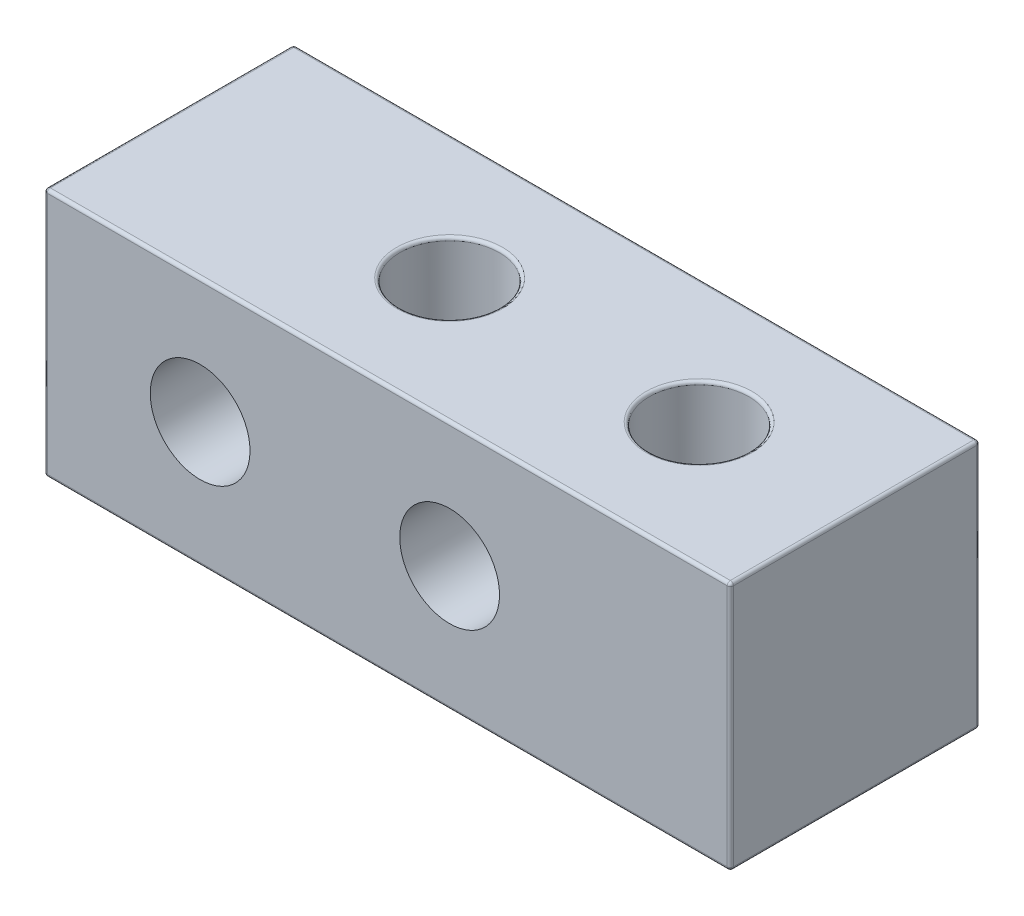
ISO-10303-21;
HEADER;
FILE_DESCRIPTION(('STEP AP214'),'2;1');
FILE_NAME('part.step','',(''),(''),'','','');
FILE_SCHEMA(('AUTOMOTIVE_DESIGN { 1 0 10303 214 1 1 1 1 }'));
ENDSEC;
DATA;
#1=APPLICATION_CONTEXT('core data for automotive mechanical design processes');
#2=APPLICATION_PROTOCOL_DEFINITION('international standard','automotive_design',2000,#1);
#3=PRODUCT_CONTEXT('',#1,'mechanical');
#4=PRODUCT('Part','Part','',(#3));
#5=PRODUCT_RELATED_PRODUCT_CATEGORY('part','',(#4));
#6=PRODUCT_DEFINITION_FORMATION('','',#4);
#7=PRODUCT_DEFINITION_CONTEXT('part definition',#1,'design');
#8=PRODUCT_DEFINITION('design','',#6,#7);
#9=PRODUCT_DEFINITION_SHAPE('','',#8);
#10=(LENGTH_UNIT() NAMED_UNIT(*) SI_UNIT(.MILLI.,.METRE.));
#11=(NAMED_UNIT(*) PLANE_ANGLE_UNIT() SI_UNIT($,.RADIAN.));
#12=(NAMED_UNIT(*) SI_UNIT($,.STERADIAN.) SOLID_ANGLE_UNIT());
#13=UNCERTAINTY_MEASURE_WITH_UNIT(LENGTH_MEASURE(1.E-05),#10,'distance_accuracy_value','');
#14=(GEOMETRIC_REPRESENTATION_CONTEXT(3) GLOBAL_UNCERTAINTY_ASSIGNED_CONTEXT((#13)) GLOBAL_UNIT_ASSIGNED_CONTEXT((#10,
#11,#12)) REPRESENTATION_CONTEXT('',''));
#15=CARTESIAN_POINT('',(0.,0.,0.));
#16=DIRECTION('',(0.,0.,1.));
#17=DIRECTION('',(1.,0.,0.));
#18=AXIS2_PLACEMENT_3D('',#15,#16,#17);
#19=CARTESIAN_POINT('',(0.,0.,8.));
#20=DIRECTION('',(1.,0.,0.));
#21=DIRECTION('',(0.,1.,0.));
#22=AXIS2_PLACEMENT_3D('',#19,#20,#21);
#23=PLANE('',#22);
#24=DIRECTION('',(0.,-1.,0.));
#25=VECTOR('',#24,1.);
#26=CARTESIAN_POINT('',(0.,0.,7.9));
#27=LINE('',#26,#25);
#28=CARTESIAN_POINT('',(0.,-7.9,7.9));
#29=VERTEX_POINT('',#28);
#30=CARTESIAN_POINT('',(0.,-0.1,7.9));
#31=VERTEX_POINT('',#30);
#32=EDGE_CURVE('E49',#29,#31,#27,.F.);
#33=ORIENTED_EDGE('',*,*,#32,.T.);
#34=DIRECTION('',(0.,0.,-1.));
#35=VECTOR('',#34,1.);
#36=CARTESIAN_POINT('',(0.,-0.1,8.));
#37=LINE('',#36,#35);
#38=CARTESIAN_POINT('',(0.,-0.1,0.0999999999999994));
#39=VERTEX_POINT('',#38);
#40=EDGE_CURVE('E11',#31,#39,#37,.T.);
#41=ORIENTED_EDGE('',*,*,#40,.T.);
#42=DIRECTION('',(0.,-1.,0.));
#43=VECTOR('',#42,1.);
#44=CARTESIAN_POINT('',(0.,0.,0.0999999999999994));
#45=LINE('',#44,#43);
#46=CARTESIAN_POINT('',(0.,-7.9,0.0999999999999994));
#47=VERTEX_POINT('',#46);
#48=EDGE_CURVE('E233',#39,#47,#45,.T.);
#49=ORIENTED_EDGE('',*,*,#48,.T.);
#50=DIRECTION('',(0.,0.,-1.));
#51=VECTOR('',#50,1.);
#52=CARTESIAN_POINT('',(0.,-7.9,8.));
#53=LINE('',#52,#51);
#54=EDGE_CURVE('E60',#47,#29,#53,.F.);
#55=ORIENTED_EDGE('',*,*,#54,.T.);
#56=EDGE_LOOP('',(#33,#41,#49,#55));
#57=FACE_BOUND('',#56,.T.);
#58=ADVANCED_FACE('F40',(#57),#23,.F.);
#59=CARTESIAN_POINT('',(0.,-8.,8.));
#60=DIRECTION('',(0.,1.,0.));
#61=DIRECTION('',(0.,0.,1.));
#62=AXIS2_PLACEMENT_3D('',#59,#60,#61);
#63=PLANE('',#62);
#64=DIRECTION('',(0.,0.,-1.));
#65=VECTOR('',#64,1.);
#66=CARTESIAN_POINT('',(21.9,-8.,8.));
#67=LINE('',#66,#65);
#68=CARTESIAN_POINT('',(21.9,-8.,0.0999999999999994));
#69=VERTEX_POINT('',#68);
#70=CARTESIAN_POINT('',(21.9,-8.,7.9));
#71=VERTEX_POINT('',#70);
#72=EDGE_CURVE('E178',#69,#71,#67,.F.);
#73=ORIENTED_EDGE('',*,*,#72,.T.);
#74=DIRECTION('',(1.,0.,0.));
#75=VECTOR('',#74,1.);
#76=CARTESIAN_POINT('',(0.,-8.,7.9));
#77=LINE('',#76,#75);
#78=CARTESIAN_POINT('',(0.100000000000001,-8.,7.9));
#79=VERTEX_POINT('',#78);
#80=EDGE_CURVE('E180',#71,#79,#77,.F.);
#81=ORIENTED_EDGE('',*,*,#80,.T.);
#82=DIRECTION('',(0.,0.,-1.));
#83=VECTOR('',#82,1.);
#84=CARTESIAN_POINT('',(0.100000000000001,-8.,8.));
#85=LINE('',#84,#83);
#86=CARTESIAN_POINT('',(0.100000000000001,-8.,0.0999999999999994));
#87=VERTEX_POINT('',#86);
#88=EDGE_CURVE('E174',#79,#87,#85,.T.);
#89=ORIENTED_EDGE('',*,*,#88,.T.);
#90=DIRECTION('',(1.,0.,0.));
#91=VECTOR('',#90,1.);
#92=CARTESIAN_POINT('',(0.,-8.,0.0999999999999994));
#93=LINE('',#92,#91);
#94=EDGE_CURVE('E176',#87,#69,#93,.T.);
#95=ORIENTED_EDGE('',*,*,#94,.T.);
#96=EDGE_LOOP('',(#73,#81,#89,#95));
#97=FACE_BOUND('',#96,.T.);
#98=CARTESIAN_POINT('',(17.,-8.,4.));
#99=DIRECTION('',(0.,1.,0.));
#100=DIRECTION('',(0.,0.,1.));
#101=AXIS2_PLACEMENT_3D('',#98,#99,#100);
#102=CIRCLE('',#101,1.6);
#103=CARTESIAN_POINT('',(17.,-8.,5.6));
#104=VERTEX_POINT('',#103);
#105=EDGE_CURVE('E297',#104,#104,#102,.T.);
#106=ORIENTED_EDGE('',*,*,#105,.T.);
#107=EDGE_LOOP('',(#106));
#108=FACE_BOUND('',#107,.T.);
#109=CARTESIAN_POINT('',(9.,-8.,4.));
#110=DIRECTION('',(0.,1.,0.));
#111=DIRECTION('',(0.,0.,1.));
#112=AXIS2_PLACEMENT_3D('',#109,#110,#111);
#113=CIRCLE('',#112,1.6);
#114=CARTESIAN_POINT('',(9.,-8.,5.6));
#115=VERTEX_POINT('',#114);
#116=EDGE_CURVE('E291',#115,#115,#113,.T.);
#117=ORIENTED_EDGE('',*,*,#116,.T.);
#118=EDGE_LOOP('',(#117));
#119=FACE_BOUND('',#118,.T.);
#120=ADVANCED_FACE('F325',(#97,#108,#119),#63,.F.);
#121=CARTESIAN_POINT('',(22.,0.,8.));
#122=DIRECTION('',(-1.,0.,0.));
#123=DIRECTION('',(0.,0.,1.));
#124=AXIS2_PLACEMENT_3D('',#121,#122,#123);
#125=PLANE('',#124);
#126=DIRECTION('',(0.,1.,0.));
#127=VECTOR('',#126,1.);
#128=CARTESIAN_POINT('',(22.,-8.,7.9));
#129=LINE('',#128,#127);
#130=CARTESIAN_POINT('',(22.,-0.1,7.9));
#131=VERTEX_POINT('',#130);
#132=CARTESIAN_POINT('',(22.,-7.9,7.9));
#133=VERTEX_POINT('',#132);
#134=EDGE_CURVE('E187',#131,#133,#129,.F.);
#135=ORIENTED_EDGE('',*,*,#134,.T.);
#136=DIRECTION('',(0.,0.,-1.));
#137=VECTOR('',#136,1.);
#138=CARTESIAN_POINT('',(22.,-7.9,8.));
#139=LINE('',#138,#137);
#140=CARTESIAN_POINT('',(22.,-7.9,0.0999999999999994));
#141=VERTEX_POINT('',#140);
#142=EDGE_CURVE('E189',#133,#141,#139,.T.);
#143=ORIENTED_EDGE('',*,*,#142,.T.);
#144=DIRECTION('',(0.,1.,0.));
#145=VECTOR('',#144,1.);
#146=CARTESIAN_POINT('',(22.,0.,0.0999999999999994));
#147=LINE('',#146,#145);
#148=CARTESIAN_POINT('',(22.,-0.1,0.0999999999999994));
#149=VERTEX_POINT('',#148);
#150=EDGE_CURVE('E183',#141,#149,#147,.T.);
#151=ORIENTED_EDGE('',*,*,#150,.T.);
#152=DIRECTION('',(0.,0.,-1.));
#153=VECTOR('',#152,1.);
#154=CARTESIAN_POINT('',(22.,-0.1,8.));
#155=LINE('',#154,#153);
#156=EDGE_CURVE('E185',#149,#131,#155,.F.);
#157=ORIENTED_EDGE('',*,*,#156,.T.);
#158=EDGE_LOOP('',(#135,#143,#151,#157));
#159=FACE_BOUND('',#158,.T.);
#160=ADVANCED_FACE('F320',(#159),#125,.F.);
#161=CARTESIAN_POINT('',(0.,0.,8.));
#162=DIRECTION('',(0.,-1.,0.));
#163=DIRECTION('',(0.,0.,-1.));
#164=AXIS2_PLACEMENT_3D('',#161,#162,#163);
#165=PLANE('',#164);
#166=CARTESIAN_POINT('',(9.,0.,4.));
#167=DIRECTION('',(0.,-1.,0.));
#168=DIRECTION('',(0.,0.,-1.));
#169=AXIS2_PLACEMENT_3D('',#166,#167,#168);
#170=CIRCLE('',#169,1.7);
#171=CARTESIAN_POINT('',(9.,0.,2.3));
#172=VERTEX_POINT('',#171);
#173=EDGE_CURVE('E203',#172,#172,#170,.T.);
#174=ORIENTED_EDGE('',*,*,#173,.T.);
#175=EDGE_LOOP('',(#174));
#176=FACE_BOUND('',#175,.T.);
#177=CARTESIAN_POINT('',(17.,0.,4.));
#178=DIRECTION('',(0.,-1.,0.));
#179=DIRECTION('',(0.,0.,-1.));
#180=AXIS2_PLACEMENT_3D('',#177,#178,#179);
#181=CIRCLE('',#180,1.7);
#182=CARTESIAN_POINT('',(17.,0.,2.3));
#183=VERTEX_POINT('',#182);
#184=EDGE_CURVE('E200',#183,#183,#181,.T.);
#185=ORIENTED_EDGE('',*,*,#184,.T.);
#186=EDGE_LOOP('',(#185));
#187=FACE_BOUND('',#186,.T.);
#188=DIRECTION('',(-1.,0.,0.));
#189=VECTOR('',#188,1.);
#190=CARTESIAN_POINT('',(22.,0.,7.9));
#191=LINE('',#190,#189);
#192=CARTESIAN_POINT('',(0.1,0.,7.9));
#193=VERTEX_POINT('',#192);
#194=CARTESIAN_POINT('',(21.9,0.,7.9));
#195=VERTEX_POINT('',#194);
#196=EDGE_CURVE('E146',#193,#195,#191,.F.);
#197=ORIENTED_EDGE('',*,*,#196,.T.);
#198=DIRECTION('',(0.,0.,-1.));
#199=VECTOR('',#198,1.);
#200=CARTESIAN_POINT('',(21.9,0.,8.));
#201=LINE('',#200,#199);
#202=CARTESIAN_POINT('',(21.9,0.,0.0999999999999994));
#203=VERTEX_POINT('',#202);
#204=EDGE_CURVE('E197',#195,#203,#201,.T.);
#205=ORIENTED_EDGE('',*,*,#204,.T.);
#206=DIRECTION('',(-1.,0.,0.));
#207=VECTOR('',#206,1.);
#208=CARTESIAN_POINT('',(0.,0.,0.0999999999999994));
#209=LINE('',#208,#207);
#210=CARTESIAN_POINT('',(0.1,0.,0.0999999999999994));
#211=VERTEX_POINT('',#210);
#212=EDGE_CURVE('E194',#203,#211,#209,.T.);
#213=ORIENTED_EDGE('',*,*,#212,.T.);
#214=DIRECTION('',(0.,0.,-1.));
#215=VECTOR('',#214,1.);
#216=CARTESIAN_POINT('',(0.1,0.,8.));
#217=LINE('',#216,#215);
#218=EDGE_CURVE('E192',#211,#193,#217,.F.);
#219=ORIENTED_EDGE('',*,*,#218,.T.);
#220=EDGE_LOOP('',(#197,#205,#213,#219));
#221=FACE_BOUND('',#220,.T.);
#222=ADVANCED_FACE('F312',(#176,#187,#221),#165,.F.);
#223=CARTESIAN_POINT('',(0.,0.,8.));
#224=DIRECTION('',(0.,0.,1.));
#225=DIRECTION('',(1.,0.,0.));
#226=AXIS2_PLACEMENT_3D('',#223,#224,#225);
#227=PLANE('',#226);
#228=DIRECTION('',(0.,-1.,0.));
#229=VECTOR('',#228,1.);
#230=CARTESIAN_POINT('',(0.100000000000001,-8.,8.));
#231=LINE('',#230,#229);
#232=CARTESIAN_POINT('',(0.1,-0.1,8.));
#233=VERTEX_POINT('',#232);
#234=CARTESIAN_POINT('',(0.100000000000001,-7.9,8.));
#235=VERTEX_POINT('',#234);
#236=EDGE_CURVE('E133',#233,#235,#231,.T.);
#237=ORIENTED_EDGE('',*,*,#236,.T.);
#238=DIRECTION('',(1.,0.,0.));
#239=VECTOR('',#238,1.);
#240=CARTESIAN_POINT('',(22.,-7.9,8.));
#241=LINE('',#240,#239);
#242=CARTESIAN_POINT('',(21.9,-7.9,8.));
#243=VERTEX_POINT('',#242);
#244=EDGE_CURVE('E172',#235,#243,#241,.T.);
#245=ORIENTED_EDGE('',*,*,#244,.T.);
#246=DIRECTION('',(0.,1.,0.));
#247=VECTOR('',#246,1.);
#248=CARTESIAN_POINT('',(21.9,0.,8.));
#249=LINE('',#248,#247);
#250=CARTESIAN_POINT('',(21.9,-0.1,8.));
#251=VERTEX_POINT('',#250);
#252=EDGE_CURVE('E136',#243,#251,#249,.T.);
#253=ORIENTED_EDGE('',*,*,#252,.T.);
#254=DIRECTION('',(-1.,0.,0.));
#255=VECTOR('',#254,1.);
#256=CARTESIAN_POINT('',(0.,-0.1,8.));
#257=LINE('',#256,#255);
#258=EDGE_CURVE('E127',#251,#233,#257,.T.);
#259=ORIENTED_EDGE('',*,*,#258,.T.);
#260=EDGE_LOOP('',(#237,#245,#253,#259));
#261=FACE_BOUND('',#260,.T.);
#262=CARTESIAN_POINT('',(5.,-4.,8.));
#263=DIRECTION('',(0.,0.,1.));
#264=DIRECTION('',(1.,0.,0.));
#265=AXIS2_PLACEMENT_3D('',#262,#263,#264);
#266=CIRCLE('',#265,1.6);
#267=CARTESIAN_POINT('',(6.6,-4.,8.));
#268=VERTEX_POINT('',#267);
#269=EDGE_CURVE('E164',#268,#268,#266,.T.);
#270=ORIENTED_EDGE('',*,*,#269,.F.);
#271=EDGE_LOOP('',(#270));
#272=FACE_BOUND('',#271,.T.);
#273=CARTESIAN_POINT('',(13.,-4.,8.));
#274=DIRECTION('',(0.,0.,1.));
#275=DIRECTION('',(1.,0.,0.));
#276=AXIS2_PLACEMENT_3D('',#273,#274,#275);
#277=CIRCLE('',#276,1.6);
#278=CARTESIAN_POINT('',(14.6,-4.,8.));
#279=VERTEX_POINT('',#278);
#280=EDGE_CURVE('E167',#279,#279,#277,.T.);
#281=ORIENTED_EDGE('',*,*,#280,.F.);
#282=EDGE_LOOP('',(#281));
#283=FACE_BOUND('',#282,.T.);
#284=ADVANCED_FACE('F129',(#261,#272,#283),#227,.T.);
#285=CARTESIAN_POINT('',(0.,0.,0.));
#286=DIRECTION('',(0.,0.,1.));
#287=DIRECTION('',(1.,0.,0.));
#288=AXIS2_PLACEMENT_3D('',#285,#286,#287);
#289=PLANE('',#288);
#290=CARTESIAN_POINT('',(13.,-4.,0.));
#291=DIRECTION('',(0.,0.,1.));
#292=DIRECTION('',(1.,0.,0.));
#293=AXIS2_PLACEMENT_3D('',#290,#291,#292);
#294=CIRCLE('',#293,1.7);
#295=CARTESIAN_POINT('',(14.7,-4.,0.));
#296=VERTEX_POINT('',#295);
#297=EDGE_CURVE('E224',#296,#296,#294,.T.);
#298=ORIENTED_EDGE('',*,*,#297,.T.);
#299=EDGE_LOOP('',(#298));
#300=FACE_BOUND('',#299,.T.);
#301=CARTESIAN_POINT('',(5.,-4.,0.));
#302=DIRECTION('',(0.,0.,1.));
#303=DIRECTION('',(1.,0.,0.));
#304=AXIS2_PLACEMENT_3D('',#301,#302,#303);
#305=CIRCLE('',#304,1.7);
#306=CARTESIAN_POINT('',(6.7,-4.,0.));
#307=VERTEX_POINT('',#306);
#308=EDGE_CURVE('E221',#307,#307,#305,.T.);
#309=ORIENTED_EDGE('',*,*,#308,.T.);
#310=EDGE_LOOP('',(#309));
#311=FACE_BOUND('',#310,.T.);
#312=DIRECTION('',(0.,1.,0.));
#313=VECTOR('',#312,1.);
#314=CARTESIAN_POINT('',(21.9,0.,0.));
#315=LINE('',#314,#313);
#316=CARTESIAN_POINT('',(21.9,-0.1,0.));
#317=VERTEX_POINT('',#316);
#318=CARTESIAN_POINT('',(21.9,-7.9,0.));
#319=VERTEX_POINT('',#318);
#320=EDGE_CURVE('E216',#317,#319,#315,.F.);
#321=ORIENTED_EDGE('',*,*,#320,.T.);
#322=DIRECTION('',(1.,0.,0.));
#323=VECTOR('',#322,1.);
#324=CARTESIAN_POINT('',(0.,-7.9,0.));
#325=LINE('',#324,#323);
#326=CARTESIAN_POINT('',(0.100000000000001,-7.9,0.));
#327=VERTEX_POINT('',#326);
#328=EDGE_CURVE('E218',#319,#327,#325,.F.);
#329=ORIENTED_EDGE('',*,*,#328,.T.);
#330=DIRECTION('',(0.,-1.,0.));
#331=VECTOR('',#330,1.);
#332=CARTESIAN_POINT('',(0.1,0.,0.));
#333=LINE('',#332,#331);
#334=CARTESIAN_POINT('',(0.1,-0.1,0.));
#335=VERTEX_POINT('',#334);
#336=EDGE_CURVE('E212',#327,#335,#333,.F.);
#337=ORIENTED_EDGE('',*,*,#336,.T.);
#338=DIRECTION('',(-1.,0.,0.));
#339=VECTOR('',#338,1.);
#340=CARTESIAN_POINT('',(0.,-0.1,0.));
#341=LINE('',#340,#339);
#342=EDGE_CURVE('E214',#335,#317,#341,.F.);
#343=ORIENTED_EDGE('',*,*,#342,.T.);
#344=EDGE_LOOP('',(#321,#329,#337,#343));
#345=FACE_BOUND('',#344,.T.);
#346=ADVANCED_FACE('F311',(#300,#311,#345),#289,.F.);
#347=CARTESIAN_POINT('',(13.,-4.,0.));
#348=DIRECTION('',(0.,0.,1.));
#349=DIRECTION('',(1.,0.,0.));
#350=AXIS2_PLACEMENT_3D('',#347,#348,#349);
#351=CYLINDRICAL_SURFACE('',#350,1.6);
#352=CARTESIAN_POINT('',(13.,-4.,0.1));
#353=DIRECTION('',(0.,0.,1.));
#354=DIRECTION('',(1.,0.,0.));
#355=AXIS2_PLACEMENT_3D('',#352,#353,#354);
#356=CIRCLE('',#355,1.6);
#357=CARTESIAN_POINT('',(14.6,-4.,0.1));
#358=VERTEX_POINT('',#357);
#359=EDGE_CURVE('E227',#358,#358,#356,.F.);
#360=ORIENTED_EDGE('',*,*,#359,.T.);
#361=EDGE_LOOP('',(#360));
#362=FACE_BOUND('',#361,.T.);
#363=ORIENTED_EDGE('',*,*,#280,.T.);
#364=EDGE_LOOP('',(#363));
#365=FACE_BOUND('',#364,.T.);
#366=ADVANCED_FACE('F308',(#362,#365),#351,.F.);
#367=CARTESIAN_POINT('',(5.,-4.,0.));
#368=DIRECTION('',(0.,0.,1.));
#369=DIRECTION('',(1.,0.,0.));
#370=AXIS2_PLACEMENT_3D('',#367,#368,#369);
#371=CYLINDRICAL_SURFACE('',#370,1.6);
#372=CARTESIAN_POINT('',(5.,-4.,0.1));
#373=DIRECTION('',(0.,0.,1.));
#374=DIRECTION('',(1.,0.,0.));
#375=AXIS2_PLACEMENT_3D('',#372,#373,#374);
#376=CIRCLE('',#375,1.6);
#377=CARTESIAN_POINT('',(6.6,-4.,0.1));
#378=VERTEX_POINT('',#377);
#379=EDGE_CURVE('E230',#378,#378,#376,.F.);
#380=ORIENTED_EDGE('',*,*,#379,.T.);
#381=EDGE_LOOP('',(#380));
#382=FACE_BOUND('',#381,.T.);
#383=ORIENTED_EDGE('',*,*,#269,.T.);
#384=EDGE_LOOP('',(#383));
#385=FACE_BOUND('',#384,.T.);
#386=ADVANCED_FACE('F487',(#382,#385),#371,.F.);
#387=CARTESIAN_POINT('',(9.,-8.,4.));
#388=DIRECTION('',(0.,1.,0.));
#389=DIRECTION('',(0.,0.,1.));
#390=AXIS2_PLACEMENT_3D('',#387,#388,#389);
#391=CYLINDRICAL_SURFACE('',#390,1.6);
#392=CARTESIAN_POINT('',(9.,-0.0999999999999994,4.));
#393=DIRECTION('',(0.,-1.,0.));
#394=DIRECTION('',(0.,0.,-1.));
#395=AXIS2_PLACEMENT_3D('',#392,#393,#394);
#396=CIRCLE('',#395,1.6);
#397=CARTESIAN_POINT('',(9.,-0.0999999999999994,2.4));
#398=VERTEX_POINT('',#397);
#399=EDGE_CURVE('E206',#398,#398,#396,.F.);
#400=ORIENTED_EDGE('',*,*,#399,.T.);
#401=EDGE_LOOP('',(#400));
#402=FACE_BOUND('',#401,.T.);
#403=ORIENTED_EDGE('',*,*,#116,.F.);
#404=EDGE_LOOP('',(#403));
#405=FACE_BOUND('',#404,.T.);
#406=ADVANCED_FACE('F497',(#402,#405),#391,.F.);
#407=CARTESIAN_POINT('',(17.,-8.,4.));
#408=DIRECTION('',(0.,1.,0.));
#409=DIRECTION('',(0.,0.,1.));
#410=AXIS2_PLACEMENT_3D('',#407,#408,#409);
#411=CYLINDRICAL_SURFACE('',#410,1.6);
#412=CARTESIAN_POINT('',(17.,-0.0999999999999994,4.));
#413=DIRECTION('',(0.,-1.,0.));
#414=DIRECTION('',(0.,0.,-1.));
#415=AXIS2_PLACEMENT_3D('',#412,#413,#414);
#416=CIRCLE('',#415,1.6);
#417=CARTESIAN_POINT('',(17.,-0.0999999999999994,2.4));
#418=VERTEX_POINT('',#417);
#419=EDGE_CURVE('E209',#418,#418,#416,.F.);
#420=ORIENTED_EDGE('',*,*,#419,.T.);
#421=EDGE_LOOP('',(#420));
#422=FACE_BOUND('',#421,.T.);
#423=ORIENTED_EDGE('',*,*,#105,.F.);
#424=EDGE_LOOP('',(#423));
#425=FACE_BOUND('',#424,.T.);
#426=ADVANCED_FACE('F406',(#422,#425),#411,.F.);
#427=CARTESIAN_POINT('',(0.,-0.1,0.0999999999999994));
#428=DIRECTION('',(-1.,0.,0.));
#429=DIRECTION('',(0.,0.,1.));
#430=AXIS2_PLACEMENT_3D('',#427,#428,#429);
#431=CYLINDRICAL_SURFACE('',#430,0.1);
#432=CARTESIAN_POINT('',(0.1,-0.1,0.0999999999999994));
#433=DIRECTION('',(-1.,0.,0.));
#434=DIRECTION('',(0.,0.,1.));
#435=AXIS2_PLACEMENT_3D('',#432,#433,#434);
#436=CIRCLE('',#435,0.1);
#437=EDGE_CURVE('E44',#211,#335,#436,.T.);
#438=ORIENTED_EDGE('',*,*,#437,.F.);
#439=ORIENTED_EDGE('',*,*,#212,.F.);
#440=CARTESIAN_POINT('',(21.9,-0.1,0.1));
#441=DIRECTION('',(1.,0.,0.));
#442=DIRECTION('',(0.,0.,-1.));
#443=AXIS2_PLACEMENT_3D('',#440,#441,#442);
#444=CIRCLE('',#443,0.1);
#445=EDGE_CURVE('E283',#317,#203,#444,.T.);
#446=ORIENTED_EDGE('',*,*,#445,.F.);
#447=ORIENTED_EDGE('',*,*,#342,.F.);
#448=EDGE_LOOP('',(#438,#439,#446,#447));
#449=FACE_BOUND('',#448,.T.);
#450=ADVANCED_FACE('F403',(#449),#431,.T.);
#451=CARTESIAN_POINT('',(0.1,-0.1,0.1));
#452=DIRECTION('',(0.,0.,-1.));
#453=DIRECTION('',(-1.,0.,0.));
#454=AXIS2_PLACEMENT_3D('',#451,#452,#453);
#455=SPHERICAL_SURFACE('',#454,0.1);
#456=CARTESIAN_POINT('',(0.1,-0.1,0.0999999999999994));
#457=DIRECTION('',(0.,0.,-1.));
#458=DIRECTION('',(-1.,0.,0.));
#459=AXIS2_PLACEMENT_3D('',#456,#457,#458);
#460=CIRCLE('',#459,0.1);
#461=EDGE_CURVE('E278',#211,#39,#460,.F.);
#462=ORIENTED_EDGE('',*,*,#461,.F.);
#463=ORIENTED_EDGE('',*,*,#437,.T.);
#464=CARTESIAN_POINT('',(0.1,-0.1,0.1));
#465=DIRECTION('',(0.,1.,0.));
#466=DIRECTION('',(-1.,0.,0.));
#467=AXIS2_PLACEMENT_3D('',#464,#465,#466);
#468=CIRCLE('',#467,0.1);
#469=EDGE_CURVE('E281',#39,#335,#468,.F.);
#470=ORIENTED_EDGE('',*,*,#469,.F.);
#471=EDGE_LOOP('',(#462,#463,#470));
#472=FACE_BOUND('',#471,.T.);
#473=ADVANCED_FACE('F400',(#472),#455,.T.);
#474=CARTESIAN_POINT('',(21.9,-0.1,0.1));
#475=DIRECTION('',(0.,1.,0.));
#476=DIRECTION('',(0.,0.,1.));
#477=AXIS2_PLACEMENT_3D('',#474,#475,#476);
#478=SPHERICAL_SURFACE('',#477,0.1);
#479=CARTESIAN_POINT('',(21.9,-0.1,0.0999999999999994));
#480=DIRECTION('',(0.,1.,0.));
#481=DIRECTION('',(0.,0.,1.));
#482=AXIS2_PLACEMENT_3D('',#479,#480,#481);
#483=CIRCLE('',#482,0.1);
#484=EDGE_CURVE('E273',#317,#149,#483,.F.);
#485=ORIENTED_EDGE('',*,*,#484,.F.);
#486=ORIENTED_EDGE('',*,*,#445,.T.);
#487=CARTESIAN_POINT('',(21.9,-0.1,0.0999999999999994));
#488=DIRECTION('',(0.,0.,-1.));
#489=DIRECTION('',(-1.,0.,0.));
#490=AXIS2_PLACEMENT_3D('',#487,#488,#489);
#491=CIRCLE('',#490,0.1);
#492=EDGE_CURVE('E276',#149,#203,#491,.F.);
#493=ORIENTED_EDGE('',*,*,#492,.F.);
#494=EDGE_LOOP('',(#485,#486,#493));
#495=FACE_BOUND('',#494,.T.);
#496=ADVANCED_FACE('F396',(#495),#478,.T.);
#497=CARTESIAN_POINT('',(0.1,0.,0.0999999999999994));
#498=DIRECTION('',(0.,-1.,0.));
#499=DIRECTION('',(1.,0.,0.));
#500=AXIS2_PLACEMENT_3D('',#497,#498,#499);
#501=CYLINDRICAL_SURFACE('',#500,0.1);
#502=ORIENTED_EDGE('',*,*,#469,.T.);
#503=ORIENTED_EDGE('',*,*,#336,.F.);
#504=CARTESIAN_POINT('',(0.100000000000001,-7.9,0.0999999999999994));
#505=DIRECTION('',(0.,-1.,0.));
#506=DIRECTION('',(0.,0.,-1.));
#507=AXIS2_PLACEMENT_3D('',#504,#505,#506);
#508=CIRCLE('',#507,0.1);
#509=EDGE_CURVE('E268',#47,#327,#508,.T.);
#510=ORIENTED_EDGE('',*,*,#509,.F.);
#511=ORIENTED_EDGE('',*,*,#48,.F.);
#512=EDGE_LOOP('',(#502,#503,#510,#511));
#513=FACE_BOUND('',#512,.T.);
#514=ADVANCED_FACE('F392',(#513),#501,.T.);
#515=CARTESIAN_POINT('',(0.1,-0.1,8.));
#516=DIRECTION('',(0.,0.,-1.));
#517=DIRECTION('',(-1.,0.,0.));
#518=AXIS2_PLACEMENT_3D('',#515,#516,#517);
#519=CYLINDRICAL_SURFACE('',#518,0.1);
#520=ORIENTED_EDGE('',*,*,#461,.T.);
#521=ORIENTED_EDGE('',*,*,#40,.F.);
#522=CARTESIAN_POINT('',(0.1,-0.1,7.9));
#523=DIRECTION('',(0.,0.,1.));
#524=DIRECTION('',(1.,0.,0.));
#525=AXIS2_PLACEMENT_3D('',#522,#523,#524);
#526=CIRCLE('',#525,0.1);
#527=EDGE_CURVE('E150',#193,#31,#526,.T.);
#528=ORIENTED_EDGE('',*,*,#527,.F.);
#529=ORIENTED_EDGE('',*,*,#218,.F.);
#530=EDGE_LOOP('',(#520,#521,#528,#529));
#531=FACE_BOUND('',#530,.T.);
#532=ADVANCED_FACE('F389',(#531),#519,.T.);
#533=CARTESIAN_POINT('',(0.,-0.1,7.9));
#534=DIRECTION('',(1.,0.,0.));
#535=DIRECTION('',(0.,0.,-1.));
#536=AXIS2_PLACEMENT_3D('',#533,#534,#535);
#537=CYLINDRICAL_SURFACE('',#536,0.1);
#538=CARTESIAN_POINT('',(21.9,-0.1,7.9));
#539=DIRECTION('',(1.,0.,0.));
#540=DIRECTION('',(0.,0.,-1.));
#541=AXIS2_PLACEMENT_3D('',#538,#539,#540);
#542=CIRCLE('',#541,0.1);
#543=EDGE_CURVE('E151',#195,#251,#542,.T.);
#544=ORIENTED_EDGE('',*,*,#543,.F.);
#545=ORIENTED_EDGE('',*,*,#196,.F.);
#546=CARTESIAN_POINT('',(0.1,-0.1,7.9));
#547=DIRECTION('',(-1.,0.,0.));
#548=DIRECTION('',(0.,0.,1.));
#549=AXIS2_PLACEMENT_3D('',#546,#547,#548);
#550=CIRCLE('',#549,0.1);
#551=EDGE_CURVE('E143',#233,#193,#550,.T.);
#552=ORIENTED_EDGE('',*,*,#551,.F.);
#553=ORIENTED_EDGE('',*,*,#258,.F.);
#554=EDGE_LOOP('',(#544,#545,#552,#553));
#555=FACE_BOUND('',#554,.T.);
#556=ADVANCED_FACE('F145',(#555),#537,.T.);
#557=CARTESIAN_POINT('',(21.9,-0.1,8.));
#558=DIRECTION('',(0.,0.,-1.));
#559=DIRECTION('',(-1.,0.,0.));
#560=AXIS2_PLACEMENT_3D('',#557,#558,#559);
#561=CYLINDRICAL_SURFACE('',#560,0.1);
#562=ORIENTED_EDGE('',*,*,#492,.T.);
#563=ORIENTED_EDGE('',*,*,#204,.F.);
#564=CARTESIAN_POINT('',(21.9,-0.1,7.9));
#565=DIRECTION('',(0.,0.,1.));
#566=DIRECTION('',(1.,0.,0.));
#567=AXIS2_PLACEMENT_3D('',#564,#565,#566);
#568=CIRCLE('',#567,0.1);
#569=EDGE_CURVE('E263',#131,#195,#568,.T.);
#570=ORIENTED_EDGE('',*,*,#569,.F.);
#571=ORIENTED_EDGE('',*,*,#156,.F.);
#572=EDGE_LOOP('',(#562,#563,#570,#571));
#573=FACE_BOUND('',#572,.T.);
#574=ADVANCED_FACE('F382',(#573),#561,.T.);
#575=CARTESIAN_POINT('',(21.9,0.,0.0999999999999994));
#576=DIRECTION('',(0.,1.,0.));
#577=DIRECTION('',(0.,0.,1.));
#578=AXIS2_PLACEMENT_3D('',#575,#576,#577);
#579=CYLINDRICAL_SURFACE('',#578,0.1);
#580=ORIENTED_EDGE('',*,*,#484,.T.);
#581=ORIENTED_EDGE('',*,*,#150,.F.);
#582=CARTESIAN_POINT('',(21.9,-7.9,0.1));
#583=DIRECTION('',(0.,-1.,0.));
#584=DIRECTION('',(0.,0.,-1.));
#585=AXIS2_PLACEMENT_3D('',#582,#583,#584);
#586=CIRCLE('',#585,0.1);
#587=EDGE_CURVE('E260',#319,#141,#586,.T.);
#588=ORIENTED_EDGE('',*,*,#587,.F.);
#589=ORIENTED_EDGE('',*,*,#320,.F.);
#590=EDGE_LOOP('',(#580,#581,#588,#589));
#591=FACE_BOUND('',#590,.T.);
#592=ADVANCED_FACE('F378',(#591),#579,.T.);
#593=CARTESIAN_POINT('',(0.,-7.9,0.0999999999999994));
#594=DIRECTION('',(1.,0.,0.));
#595=DIRECTION('',(0.,0.,-1.));
#596=AXIS2_PLACEMENT_3D('',#593,#594,#595);
#597=CYLINDRICAL_SURFACE('',#596,0.1);
#598=CARTESIAN_POINT('',(0.100000000000001,-7.9,0.1));
#599=DIRECTION('',(-1.,0.,0.));
#600=DIRECTION('',(0.,0.,1.));
#601=AXIS2_PLACEMENT_3D('',#598,#599,#600);
#602=CIRCLE('',#601,0.1);
#603=EDGE_CURVE('E270',#327,#87,#602,.T.);
#604=ORIENTED_EDGE('',*,*,#603,.F.);
#605=ORIENTED_EDGE('',*,*,#328,.F.);
#606=CARTESIAN_POINT('',(21.9,-7.9,0.0999999999999994));
#607=DIRECTION('',(1.,0.,0.));
#608=DIRECTION('',(0.,0.,-1.));
#609=AXIS2_PLACEMENT_3D('',#606,#607,#608);
#610=CIRCLE('',#609,0.1);
#611=EDGE_CURVE('E257',#69,#319,#610,.T.);
#612=ORIENTED_EDGE('',*,*,#611,.F.);
#613=ORIENTED_EDGE('',*,*,#94,.F.);
#614=EDGE_LOOP('',(#604,#605,#612,#613));
#615=FACE_BOUND('',#614,.T.);
#616=ADVANCED_FACE('F374',(#615),#597,.T.);
#617=CARTESIAN_POINT('',(0.100000000000001,-7.9,0.1));
#618=DIRECTION('',(0.,0.,-1.));
#619=DIRECTION('',(-1.,0.,0.));
#620=AXIS2_PLACEMENT_3D('',#617,#618,#619);
#621=SPHERICAL_SURFACE('',#620,0.1);
#622=ORIENTED_EDGE('',*,*,#509,.T.);
#623=ORIENTED_EDGE('',*,*,#603,.T.);
#624=CARTESIAN_POINT('',(0.100000000000001,-7.9,0.0999999999999994));
#625=DIRECTION('',(0.,0.,-1.));
#626=DIRECTION('',(-1.,0.,0.));
#627=AXIS2_PLACEMENT_3D('',#624,#625,#626);
#628=CIRCLE('',#627,0.1);
#629=EDGE_CURVE('E157',#47,#87,#628,.F.);
#630=ORIENTED_EDGE('',*,*,#629,.F.);
#631=EDGE_LOOP('',(#622,#623,#630));
#632=FACE_BOUND('',#631,.T.);
#633=ADVANCED_FACE('F371',(#632),#621,.T.);
#634=CARTESIAN_POINT('',(0.1,-0.1,7.9));
#635=DIRECTION('',(0.,1.,0.));
#636=DIRECTION('',(0.,0.,1.));
#637=AXIS2_PLACEMENT_3D('',#634,#635,#636);
#638=SPHERICAL_SURFACE('',#637,0.1);
#639=ORIENTED_EDGE('',*,*,#551,.T.);
#640=ORIENTED_EDGE('',*,*,#527,.T.);
#641=CARTESIAN_POINT('',(0.1,-0.1,7.9));
#642=DIRECTION('',(0.,1.,0.));
#643=DIRECTION('',(-1.,0.,0.));
#644=AXIS2_PLACEMENT_3D('',#641,#642,#643);
#645=CIRCLE('',#644,0.1);
#646=EDGE_CURVE('E154',#233,#31,#645,.F.);
#647=ORIENTED_EDGE('',*,*,#646,.F.);
#648=EDGE_LOOP('',(#639,#640,#647));
#649=FACE_BOUND('',#648,.T.);
#650=ADVANCED_FACE('F155',(#649),#638,.T.);
#651=CARTESIAN_POINT('',(21.9,-0.1,7.9));
#652=DIRECTION('',(0.,1.,0.));
#653=DIRECTION('',(0.,0.,1.));
#654=AXIS2_PLACEMENT_3D('',#651,#652,#653);
#655=SPHERICAL_SURFACE('',#654,0.1);
#656=ORIENTED_EDGE('',*,*,#569,.T.);
#657=ORIENTED_EDGE('',*,*,#543,.T.);
#658=CARTESIAN_POINT('',(21.9,-0.1,7.9));
#659=DIRECTION('',(0.,1.,0.));
#660=DIRECTION('',(0.,0.,1.));
#661=AXIS2_PLACEMENT_3D('',#658,#659,#660);
#662=CIRCLE('',#661,0.1);
#663=EDGE_CURVE('E158',#131,#251,#662,.F.);
#664=ORIENTED_EDGE('',*,*,#663,.F.);
#665=EDGE_LOOP('',(#656,#657,#664));
#666=FACE_BOUND('',#665,.T.);
#667=ADVANCED_FACE('F364',(#666),#655,.T.);
#668=CARTESIAN_POINT('',(21.9,-7.9,0.1));
#669=DIRECTION('',(0.,0.,-1.));
#670=DIRECTION('',(-1.,0.,0.));
#671=AXIS2_PLACEMENT_3D('',#668,#669,#670);
#672=SPHERICAL_SURFACE('',#671,0.1);
#673=ORIENTED_EDGE('',*,*,#611,.T.);
#674=ORIENTED_EDGE('',*,*,#587,.T.);
#675=CARTESIAN_POINT('',(21.9,-7.9,0.0999999999999994));
#676=DIRECTION('',(0.,0.,-1.));
#677=DIRECTION('',(-1.,0.,0.));
#678=AXIS2_PLACEMENT_3D('',#675,#676,#677);
#679=CIRCLE('',#678,0.1);
#680=EDGE_CURVE('E251',#69,#141,#679,.F.);
#681=ORIENTED_EDGE('',*,*,#680,.F.);
#682=EDGE_LOOP('',(#673,#674,#681));
#683=FACE_BOUND('',#682,.T.);
#684=ADVANCED_FACE('F360',(#683),#672,.T.);
#685=CARTESIAN_POINT('',(0.100000000000001,-7.9,8.));
#686=DIRECTION('',(0.,0.,-1.));
#687=DIRECTION('',(-1.,0.,0.));
#688=AXIS2_PLACEMENT_3D('',#685,#686,#687);
#689=CYLINDRICAL_SURFACE('',#688,0.1);
#690=ORIENTED_EDGE('',*,*,#629,.T.);
#691=ORIENTED_EDGE('',*,*,#88,.F.);
#692=CARTESIAN_POINT('',(0.100000000000001,-7.9,7.9));
#693=DIRECTION('',(0.,0.,1.));
#694=DIRECTION('',(1.,0.,0.));
#695=AXIS2_PLACEMENT_3D('',#692,#693,#694);
#696=CIRCLE('',#695,0.1);
#697=EDGE_CURVE('E248',#29,#79,#696,.T.);
#698=ORIENTED_EDGE('',*,*,#697,.F.);
#699=ORIENTED_EDGE('',*,*,#54,.F.);
#700=EDGE_LOOP('',(#690,#691,#698,#699));
#701=FACE_BOUND('',#700,.T.);
#702=ADVANCED_FACE('F357',(#701),#689,.T.);
#703=CARTESIAN_POINT('',(0.1,0.,7.9));
#704=DIRECTION('',(0.,1.,0.));
#705=DIRECTION('',(-1.,0.,0.));
#706=AXIS2_PLACEMENT_3D('',#703,#704,#705);
#707=CYLINDRICAL_SURFACE('',#706,0.1);
#708=ORIENTED_EDGE('',*,*,#646,.T.);
#709=ORIENTED_EDGE('',*,*,#32,.F.);
#710=CARTESIAN_POINT('',(0.100000000000001,-7.9,7.9));
#711=DIRECTION('',(0.,-1.,0.));
#712=DIRECTION('',(0.,0.,-1.));
#713=AXIS2_PLACEMENT_3D('',#710,#711,#712);
#714=CIRCLE('',#713,0.1);
#715=EDGE_CURVE('E162',#235,#29,#714,.T.);
#716=ORIENTED_EDGE('',*,*,#715,.F.);
#717=ORIENTED_EDGE('',*,*,#236,.F.);
#718=EDGE_LOOP('',(#708,#709,#716,#717));
#719=FACE_BOUND('',#718,.T.);
#720=ADVANCED_FACE('F160',(#719),#707,.T.);
#721=CARTESIAN_POINT('',(21.9,0.,7.9));
#722=DIRECTION('',(0.,-1.,0.));
#723=DIRECTION('',(0.,0.,-1.));
#724=AXIS2_PLACEMENT_3D('',#721,#722,#723);
#725=CYLINDRICAL_SURFACE('',#724,0.1);
#726=ORIENTED_EDGE('',*,*,#663,.T.);
#727=ORIENTED_EDGE('',*,*,#252,.F.);
#728=CARTESIAN_POINT('',(21.9,-7.9,7.9));
#729=DIRECTION('',(0.,-1.,0.));
#730=DIRECTION('',(0.,0.,-1.));
#731=AXIS2_PLACEMENT_3D('',#728,#729,#730);
#732=CIRCLE('',#731,0.1);
#733=EDGE_CURVE('E244',#133,#243,#732,.T.);
#734=ORIENTED_EDGE('',*,*,#733,.F.);
#735=ORIENTED_EDGE('',*,*,#134,.F.);
#736=EDGE_LOOP('',(#726,#727,#734,#735));
#737=FACE_BOUND('',#736,.T.);
#738=ADVANCED_FACE('F350',(#737),#725,.T.);
#739=CARTESIAN_POINT('',(21.9,-7.9,8.));
#740=DIRECTION('',(0.,0.,-1.));
#741=DIRECTION('',(-1.,0.,0.));
#742=AXIS2_PLACEMENT_3D('',#739,#740,#741);
#743=CYLINDRICAL_SURFACE('',#742,0.1);
#744=ORIENTED_EDGE('',*,*,#680,.T.);
#745=ORIENTED_EDGE('',*,*,#142,.F.);
#746=CARTESIAN_POINT('',(21.9,-7.9,7.9));
#747=DIRECTION('',(0.,0.,1.));
#748=DIRECTION('',(1.,0.,0.));
#749=AXIS2_PLACEMENT_3D('',#746,#747,#748);
#750=CIRCLE('',#749,0.1);
#751=EDGE_CURVE('E241',#71,#133,#750,.T.);
#752=ORIENTED_EDGE('',*,*,#751,.F.);
#753=ORIENTED_EDGE('',*,*,#72,.F.);
#754=EDGE_LOOP('',(#744,#745,#752,#753));
#755=FACE_BOUND('',#754,.T.);
#756=ADVANCED_FACE('F346',(#755),#743,.T.);
#757=CARTESIAN_POINT('',(0.100000000000001,-7.9,7.9));
#758=DIRECTION('',(-1.,0.,0.));
#759=DIRECTION('',(0.,0.,1.));
#760=AXIS2_PLACEMENT_3D('',#757,#758,#759);
#761=SPHERICAL_SURFACE('',#760,0.1);
#762=ORIENTED_EDGE('',*,*,#715,.T.);
#763=ORIENTED_EDGE('',*,*,#697,.T.);
#764=CARTESIAN_POINT('',(0.100000000000001,-7.9,7.9));
#765=DIRECTION('',(-1.,0.,0.));
#766=DIRECTION('',(0.,0.,1.));
#767=AXIS2_PLACEMENT_3D('',#764,#765,#766);
#768=CIRCLE('',#767,0.1);
#769=EDGE_CURVE('E239',#235,#79,#768,.F.);
#770=ORIENTED_EDGE('',*,*,#769,.F.);
#771=EDGE_LOOP('',(#762,#763,#770));
#772=FACE_BOUND('',#771,.T.);
#773=ADVANCED_FACE('F342',(#772),#761,.T.);
#774=CARTESIAN_POINT('',(21.9,-7.9,7.9));
#775=DIRECTION('',(1.,0.,0.));
#776=DIRECTION('',(0.,0.,-1.));
#777=AXIS2_PLACEMENT_3D('',#774,#775,#776);
#778=SPHERICAL_SURFACE('',#777,0.1);
#779=ORIENTED_EDGE('',*,*,#751,.T.);
#780=ORIENTED_EDGE('',*,*,#733,.T.);
#781=CARTESIAN_POINT('',(21.9,-7.9,7.9));
#782=DIRECTION('',(1.,0.,0.));
#783=DIRECTION('',(0.,0.,-1.));
#784=AXIS2_PLACEMENT_3D('',#781,#782,#783);
#785=CIRCLE('',#784,0.1);
#786=EDGE_CURVE('E237',#71,#243,#785,.F.);
#787=ORIENTED_EDGE('',*,*,#786,.F.);
#788=EDGE_LOOP('',(#779,#780,#787));
#789=FACE_BOUND('',#788,.T.);
#790=ADVANCED_FACE('F338',(#789),#778,.T.);
#791=CARTESIAN_POINT('',(0.,-7.9,7.9));
#792=DIRECTION('',(-1.,0.,0.));
#793=DIRECTION('',(0.,0.,1.));
#794=AXIS2_PLACEMENT_3D('',#791,#792,#793);
#795=CYLINDRICAL_SURFACE('',#794,0.1);
#796=ORIENTED_EDGE('',*,*,#769,.T.);
#797=ORIENTED_EDGE('',*,*,#80,.F.);
#798=ORIENTED_EDGE('',*,*,#786,.T.);
#799=ORIENTED_EDGE('',*,*,#244,.F.);
#800=EDGE_LOOP('',(#796,#797,#798,#799));
#801=FACE_BOUND('',#800,.T.);
#802=ADVANCED_FACE('F334',(#801),#795,.T.);
#803=CARTESIAN_POINT('',(9.,-0.0999999999999994,4.));
#804=DIRECTION('',(0.,-1.,0.));
#805=DIRECTION('',(0.,0.,-1.));
#806=AXIS2_PLACEMENT_3D('',#803,#804,#805);
#807=TOROIDAL_SURFACE('',#806,1.7,0.1);
#808=ORIENTED_EDGE('',*,*,#173,.F.);
#809=EDGE_LOOP('',(#808));
#810=FACE_BOUND('',#809,.T.);
#811=ORIENTED_EDGE('',*,*,#399,.F.);
#812=EDGE_LOOP('',(#811));
#813=FACE_BOUND('',#812,.T.);
#814=ADVANCED_FACE('F337',(#810,#813),#807,.T.);
#815=CARTESIAN_POINT('',(17.,-0.0999999999999994,4.));
#816=DIRECTION('',(0.,-1.,0.));
#817=DIRECTION('',(0.,0.,-1.));
#818=AXIS2_PLACEMENT_3D('',#815,#816,#817);
#819=TOROIDAL_SURFACE('',#818,1.7,0.1);
#820=ORIENTED_EDGE('',*,*,#184,.F.);
#821=EDGE_LOOP('',(#820));
#822=FACE_BOUND('',#821,.T.);
#823=ORIENTED_EDGE('',*,*,#419,.F.);
#824=EDGE_LOOP('',(#823));
#825=FACE_BOUND('',#824,.T.);
#826=ADVANCED_FACE('F410',(#822,#825),#819,.T.);
#827=CARTESIAN_POINT('',(13.,-4.,0.1));
#828=DIRECTION('',(0.,0.,1.));
#829=DIRECTION('',(1.,0.,0.));
#830=AXIS2_PLACEMENT_3D('',#827,#828,#829);
#831=TOROIDAL_SURFACE('',#830,1.7,0.1);
#832=ORIENTED_EDGE('',*,*,#359,.F.);
#833=EDGE_LOOP('',(#832));
#834=FACE_BOUND('',#833,.T.);
#835=ORIENTED_EDGE('',*,*,#297,.F.);
#836=EDGE_LOOP('',(#835));
#837=FACE_BOUND('',#836,.T.);
#838=ADVANCED_FACE('F413',(#834,#837),#831,.T.);
#839=CARTESIAN_POINT('',(5.,-4.,0.1));
#840=DIRECTION('',(0.,0.,1.));
#841=DIRECTION('',(1.,0.,0.));
#842=AXIS2_PLACEMENT_3D('',#839,#840,#841);
#843=TOROIDAL_SURFACE('',#842,1.7,0.1);
#844=ORIENTED_EDGE('',*,*,#379,.F.);
#845=EDGE_LOOP('',(#844));
#846=FACE_BOUND('',#845,.T.);
#847=ORIENTED_EDGE('',*,*,#308,.F.);
#848=EDGE_LOOP('',(#847));
#849=FACE_BOUND('',#848,.T.);
#850=ADVANCED_FACE('F42',(#846,#849),#843,.T.);
#851=CLOSED_SHELL('',(#58,#120,#160,#222,#284,#346,#366,#386,#406,#426,#450,#473,#496,#514,#532,
#556,#574,#592,#616,#633,#650,#667,#684,#702,#720,#738,#756,#773,#790,#802,#814,#826,#838,#850));
#852=MANIFOLD_SOLID_BREP('B2',#851);
#853=ADVANCED_BREP_SHAPE_REPRESENTATION('',(#18,#852),#14);
#854=SHAPE_DEFINITION_REPRESENTATION(#9,#853);
ENDSEC;
END-ISO-10303-21;
